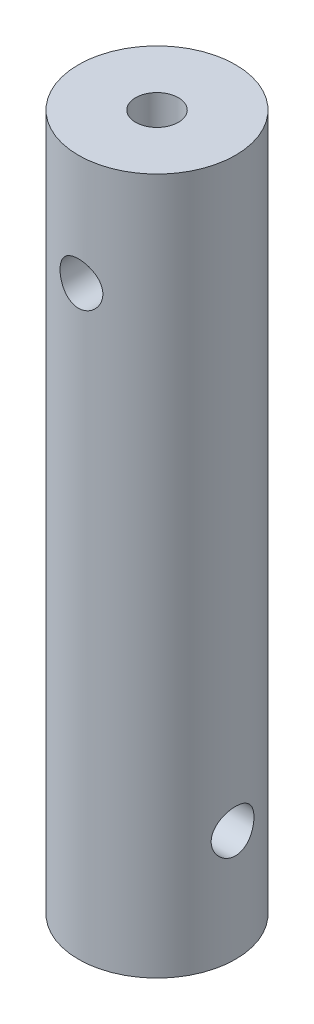
ISO-10303-21;
HEADER;
FILE_DESCRIPTION(('STEP AP214'),'2;1');
FILE_NAME('part.step','',(''),(''),'','','');
FILE_SCHEMA(('AUTOMOTIVE_DESIGN { 1 0 10303 214 1 1 1 1 }'));
ENDSEC;
DATA;
#1=APPLICATION_CONTEXT('core data for automotive mechanical design processes');
#2=APPLICATION_PROTOCOL_DEFINITION('international standard','automotive_design',2000,#1);
#3=PRODUCT_CONTEXT('',#1,'mechanical');
#4=PRODUCT('Part','Part','',(#3));
#5=PRODUCT_RELATED_PRODUCT_CATEGORY('part','',(#4));
#6=PRODUCT_DEFINITION_FORMATION('','',#4);
#7=PRODUCT_DEFINITION_CONTEXT('part definition',#1,'design');
#8=PRODUCT_DEFINITION('design','',#6,#7);
#9=PRODUCT_DEFINITION_SHAPE('','',#8);
#10=(LENGTH_UNIT() NAMED_UNIT(*) SI_UNIT(.MILLI.,.METRE.));
#11=(NAMED_UNIT(*) PLANE_ANGLE_UNIT() SI_UNIT($,.RADIAN.));
#12=(NAMED_UNIT(*) SI_UNIT($,.STERADIAN.) SOLID_ANGLE_UNIT());
#13=UNCERTAINTY_MEASURE_WITH_UNIT(LENGTH_MEASURE(1.E-05),#10,'distance_accuracy_value','');
#14=(GEOMETRIC_REPRESENTATION_CONTEXT(3) GLOBAL_UNCERTAINTY_ASSIGNED_CONTEXT((#13)) GLOBAL_UNIT_ASSIGNED_CONTEXT((#10,
#11,#12)) REPRESENTATION_CONTEXT('',''));
#15=CARTESIAN_POINT('',(0.,0.,0.));
#16=DIRECTION('',(0.,0.,1.));
#17=DIRECTION('',(1.,0.,0.));
#18=AXIS2_PLACEMENT_3D('',#15,#16,#17);
#19=CARTESIAN_POINT('',(5.8293,20.,0.));
#20=DIRECTION('',(0.,1.,0.));
#21=DIRECTION('',(0.,0.,1.));
#22=AXIS2_PLACEMENT_3D('',#19,#20,#21);
#23=PLANE('',#22);
#24=CARTESIAN_POINT('',(0.,20.,0.));
#25=DIRECTION('',(0.,-1.,0.));
#26=DIRECTION('',(0.,0.,-1.));
#27=AXIS2_PLACEMENT_3D('',#24,#25,#26);
#28=CIRCLE('',#27,1.7272);
#29=CARTESIAN_POINT('',(0.,20.,-1.7272));
#30=VERTEX_POINT('',#29);
#31=EDGE_CURVE('E102',#30,#30,#28,.T.);
#32=ORIENTED_EDGE('',*,*,#31,.F.);
#33=EDGE_LOOP('',(#32));
#34=FACE_BOUND('',#33,.T.);
#35=CARTESIAN_POINT('',(0.,20.,0.));
#36=DIRECTION('',(0.,1.,0.));
#37=DIRECTION('',(0.,0.,1.));
#38=AXIS2_PLACEMENT_3D('',#35,#36,#37);
#39=CIRCLE('',#38,6.3373);
#40=CARTESIAN_POINT('',(0.,20.,6.3373));
#41=VERTEX_POINT('',#40);
#42=EDGE_CURVE('E105',#41,#41,#39,.F.);
#43=ORIENTED_EDGE('',*,*,#42,.T.);
#44=EDGE_LOOP('',(#43));
#45=FACE_BOUND('',#44,.T.);
#46=ADVANCED_FACE('F17',(#34,#45),#23,.F.);
#47=CARTESIAN_POINT('',(0.,76.2,0.));
#48=DIRECTION('',(0.,1.,0.));
#49=DIRECTION('',(0.,0.,1.));
#50=AXIS2_PLACEMENT_3D('',#47,#48,#49);
#51=CYLINDRICAL_SURFACE('',#50,6.3373);
#52=CARTESIAN_POINT('',(0.,68.9650064611844,-6.3373));
#53=CARTESIAN_POINT('',(-0.0951376744111191,68.9650043686545,-6.33729864681633));
#54=CARTESIAN_POINT('',(-0.190297467882874,68.9571195857964,-6.33513665790667));
#55=CARTESIAN_POINT('',(-0.377870686616131,68.9258477817384,-6.3267222151742));
#56=CARTESIAN_POINT('',(-0.470282856307396,68.9024537837496,-6.32046792045245));
#57=CARTESIAN_POINT('',(-0.64962656253029,68.8409844502643,-6.30455833904176));
#58=CARTESIAN_POINT('',(-0.736565164620519,68.802928512772,-6.29490754743149));
#59=CARTESIAN_POINT('',(-0.902826293362718,68.7132887916404,-6.27322201943463));
#60=CARTESIAN_POINT('',(-0.982148222671457,68.6617039481685,-6.26118709629709));
#61=CARTESIAN_POINT('',(-1.13283824354689,68.5451569987471,-6.23570533321872));
#62=CARTESIAN_POINT('',(-1.20399639458276,68.4799289064219,-6.22223352256161));
#63=CARTESIAN_POINT('',(-1.33451119126664,68.3385153366035,-6.19555470242467));
#64=CARTESIAN_POINT('',(-1.39386624478539,68.2623283832463,-6.18234772888468));
#65=CARTESIAN_POINT('',(-1.5001270944284,68.0994671467314,-6.15743707536004));
#66=CARTESIAN_POINT('',(-1.54678890596214,68.0126284223276,-6.14576482420407));
#67=CARTESIAN_POINT('',(-1.6247662688059,67.8319684792267,-6.12561337650056));
#68=CARTESIAN_POINT('',(-1.65608479057674,67.7381486161325,-6.11713356197097));
#69=CARTESIAN_POINT('',(-1.70175271630764,67.5485204363137,-6.10458532248206));
#70=CARTESIAN_POINT('',(-1.71648387490563,67.4528107742585,-6.100417841372));
#71=CARTESIAN_POINT('',(-1.72974944241345,67.2601948271869,-6.09667038004404));
#72=CARTESIAN_POINT('',(-1.72828702441142,67.1632887803162,-6.09708950109348));
#73=CARTESIAN_POINT('',(-1.70950947746585,66.9740309275864,-6.10237937558624));
#74=CARTESIAN_POINT('',(-1.69265894569603,66.8816287952162,-6.1071196573165));
#75=CARTESIAN_POINT('',(-1.64432870428128,66.7010156034818,-6.12030846973005));
#76=CARTESIAN_POINT('',(-1.61284777907714,66.6128048930313,-6.12875730853378));
#77=CARTESIAN_POINT('',(-1.53577804799442,66.4418801666521,-6.14852417292795));
#78=CARTESIAN_POINT('',(-1.49002844755493,66.3592425608396,-6.15987461978977));
#79=CARTESIAN_POINT('',(-1.38583211856977,66.2026552924149,-6.18414867747771));
#80=CARTESIAN_POINT('',(-1.32738279064126,66.1287074131992,-6.19707261012679));
#81=CARTESIAN_POINT('',(-1.19708208777922,65.9889473695876,-6.2235782005109));
#82=CARTESIAN_POINT('',(-1.12484130718423,65.9234991263589,-6.2371672499884));
#83=CARTESIAN_POINT('',(-0.970242636206939,65.80557003518,-6.26307708484607));
#84=CARTESIAN_POINT('',(-0.887884311351086,65.7530897443989,-6.27539781571956));
#85=CARTESIAN_POINT('',(-0.714808460885522,65.6624160850076,-6.29746427332398));
#86=CARTESIAN_POINT('',(-0.624053446211196,65.6242910634218,-6.30719761823381));
#87=CARTESIAN_POINT('',(-0.437095728938046,65.5639457334528,-6.32290323631227));
#88=CARTESIAN_POINT('',(-0.340894277055788,65.541721789414,-6.32887636918607));
#89=CARTESIAN_POINT('',(-0.148878213031966,65.5143866438165,-6.33625752613276));
#90=CARTESIAN_POINT('',(-0.0531389599851033,65.5087809408974,-6.33779742640835));
#91=CARTESIAN_POINT('',(0.137912569095707,65.5134723425647,-6.33651906781653));
#92=CARTESIAN_POINT('',(0.233224890262333,65.5237677243956,-6.33370128106969));
#93=CARTESIAN_POINT('',(0.418934951159386,65.5595642910566,-6.32410955859912));
#94=CARTESIAN_POINT('',(0.509390366095269,65.5847874452706,-6.31740800453026));
#95=CARTESIAN_POINT('',(0.684775505098286,65.6493987491432,-6.30081108672499));
#96=CARTESIAN_POINT('',(0.769704615961933,65.6887884675815,-6.29091536928513));
#97=CARTESIAN_POINT('',(0.933530729619364,65.7815170991867,-6.26872146969095));
#98=CARTESIAN_POINT('',(1.01227093207412,65.8351221015718,-6.25637873271262));
#99=CARTESIAN_POINT('',(1.15981126566655,65.9544271045516,-6.23071636948649));
#100=CARTESIAN_POINT('',(1.22860933769476,66.0201296042631,-6.21739654173266));
#101=CARTESIAN_POINT('',(1.35641259216658,66.1640757365502,-6.1907923211858));
#102=CARTESIAN_POINT('',(1.41506825830059,66.242632626605,-6.17752061006974));
#103=CARTESIAN_POINT('',(1.51837489847868,66.4087570073209,-6.15294557775481));
#104=CARTESIAN_POINT('',(1.56302643366734,66.4963241367556,-6.14164217769394));
#105=CARTESIAN_POINT('',(1.63672273360468,66.6775649377132,-6.12241467001691));
#106=CARTESIAN_POINT('',(1.66585610334491,66.7712004400218,-6.1144714314865));
#107=CARTESIAN_POINT('',(1.70788706532457,66.9622963223403,-6.10286634048693));
#108=CARTESIAN_POINT('',(1.72078903417116,67.0597556639849,-6.09920333392231));
#109=CARTESIAN_POINT('',(1.72973108189937,67.2521459560409,-6.09667286629301));
#110=CARTESIAN_POINT('',(1.72633417229053,67.3470490151476,-6.09764527650933));
#111=CARTESIAN_POINT('',(1.70408727659399,67.534874186537,-6.10389945687251));
#112=CARTESIAN_POINT('',(1.68523772236194,67.6277963541052,-6.10918110658888));
#113=CARTESIAN_POINT('',(1.63295363857791,67.808277931505,-6.12336120696575));
#114=CARTESIAN_POINT('',(1.59964342654877,67.895875952665,-6.13222878603006));
#115=CARTESIAN_POINT('',(1.51947987056016,68.064307351525,-6.15258114422972));
#116=CARTESIAN_POINT('',(1.47262431690102,68.1451396227275,-6.16406635032313));
#117=CARTESIAN_POINT('',(1.36501510217198,68.3004199979666,-6.18879930682536));
#118=CARTESIAN_POINT('',(1.30387965433842,68.3745966695788,-6.20209027313998));
#119=CARTESIAN_POINT('',(1.17016556429537,68.5118210182525,-6.22870155248908));
#120=CARTESIAN_POINT('',(1.09758411581629,68.5748659580395,-6.24202187192843));
#121=CARTESIAN_POINT('',(0.941055301848463,68.6894443923546,-6.26755195202529));
#122=CARTESIAN_POINT('',(0.856887755044623,68.7406848461489,-6.27972972931358));
#123=CARTESIAN_POINT('',(0.680802983391851,68.8282089503465,-6.30124767260493));
#124=CARTESIAN_POINT('',(0.588890553787259,68.8645017747929,-6.3105895781834));
#125=CARTESIAN_POINT('',(0.414492113342096,68.916611018558,-6.32423989108634));
#126=CARTESIAN_POINT('',(0.332726034555767,68.9347160329965,-6.32910096501772));
#127=CARTESIAN_POINT('',(0.16731220230855,68.9589140224536,-6.33563144124733));
#128=CARTESIAN_POINT('',(0.083664654098915,68.965008301368,-6.33730118999801));
#129=CARTESIAN_POINT('',(0.,68.9650064611844,-6.3373));
#130=B_SPLINE_CURVE_WITH_KNOTS('',3,(#52,#53,#54,#55,#56,#57,#58,#59,#60,#61,#62,#63,#64,#65,
#66,#67,#68,#69,#70,#71,#72,#73,#74,#75,#76,#77,#78,#79,#80,#81,#82,#83,#84,#85,#86,#87,#88,#89,
#90,#91,#92,#93,#94,#95,#96,#97,#98,#99,#100,#101,#102,#103,#104,#105,#106,#107,#108,#109,#110,
#111,#112,#113,#114,#115,#116,#117,#118,#119,#120,#121,#122,#123,#124,#125,#126,#127,#128,#129),
.UNSPECIFIED.,.T.,.F.,(4,2,2,2,2,2,2,2,2,2,2,2,2,2,2,2,2,2,2,2,2,2,2,2,2,2,2,2,2,2,2,2,2,2,2,2,
2,2,4),(0.,0.285106120738118,0.570340582991151,0.855198963769226,1.14007966656275,
1.43114203934368,1.72224364716802,2.01859839154833,2.31489573895659,2.60422482109503,
2.89349721097502,3.17431465978547,3.45515544435079,3.7392829436408,4.02346865308145,
4.31735600314266,4.61125597790241,4.90653806202597,5.20175261064438,5.48808975476768,
5.77439587872257,6.05553028787058,6.33669583892709,6.62354976425783,6.91046301487155,
7.20585583088746,7.50123680902046,7.79491264610795,8.08850927996145,8.37203871511603,
8.65556022673306,8.93669114520429,9.21786795146533,9.50765841364901,9.79752003589575,
10.0939462779324,10.3901903175525,10.6409416111918,10.8916656815528),.UNSPECIFIED.);
#131=CARTESIAN_POINT('',(0.,68.9650064611844,-6.3373));
#132=VERTEX_POINT('',#131);
#133=EDGE_CURVE('E59',#132,#132,#130,.T.);
#134=ORIENTED_EDGE('',*,*,#133,.T.);
#135=EDGE_LOOP('',(#134));
#136=FACE_BOUND('',#135,.T.);
#137=CARTESIAN_POINT('',(0.,65.5106064611844,6.3373));
#138=CARTESIAN_POINT('',(-0.0951376744111154,65.5106085537143,6.33729864681633));
#139=CARTESIAN_POINT('',(-0.190297467882863,65.5184933365725,6.33513665790667));
#140=CARTESIAN_POINT('',(-0.377870686616126,65.5497651406304,6.3267222151742));
#141=CARTESIAN_POINT('',(-0.470282856307405,65.5731591386191,6.32046792045245));
#142=CARTESIAN_POINT('',(-0.649626562530294,65.6346284721044,6.30455833904176));
#143=CARTESIAN_POINT('',(-0.736565164620502,65.6726844095968,6.29490754743149));
#144=CARTESIAN_POINT('',(-0.902826293362695,65.7623241307284,6.27322201943463));
#145=CARTESIAN_POINT('',(-0.982148222671449,65.8139089742003,6.26118709629709));
#146=CARTESIAN_POINT('',(-1.13283824354689,65.9304559236217,6.23570533321872));
#147=CARTESIAN_POINT('',(-1.20399639458275,65.9956840159469,6.22223352256161));
#148=CARTESIAN_POINT('',(-1.33451119126664,66.1370975857653,6.19555470242467));
#149=CARTESIAN_POINT('',(-1.39386624478539,66.2132845391226,6.18234772888468));
#150=CARTESIAN_POINT('',(-1.5001270944284,66.3761457756374,6.15743707536004));
#151=CARTESIAN_POINT('',(-1.54678890596214,66.4629845000412,6.14576482420407));
#152=CARTESIAN_POINT('',(-1.6247662688059,66.6436444431421,6.12561337650056));
#153=CARTESIAN_POINT('',(-1.65608479057674,66.7374643062363,6.11713356197097));
#154=CARTESIAN_POINT('',(-1.70175271630764,66.9270924860551,6.10458532248206));
#155=CARTESIAN_POINT('',(-1.71648387490563,67.0228021481103,6.10041784137201));
#156=CARTESIAN_POINT('',(-1.72974944241345,67.2154180951818,6.09667038004404));
#157=CARTESIAN_POINT('',(-1.72828702441142,67.3123241420526,6.09708950109348));
#158=CARTESIAN_POINT('',(-1.70950947746585,67.5015819947824,6.10237937558624));
#159=CARTESIAN_POINT('',(-1.69265894569604,67.5939841271527,6.1071196573165));
#160=CARTESIAN_POINT('',(-1.64432870428128,67.774597318887,6.12030846973005));
#161=CARTESIAN_POINT('',(-1.61284777907714,67.8628080293374,6.12875730853378));
#162=CARTESIAN_POINT('',(-1.53577804799442,68.0337327557167,6.14852417292795));
#163=CARTESIAN_POINT('',(-1.49002844755493,68.1163703615291,6.15987461978977));
#164=CARTESIAN_POINT('',(-1.38583211856978,68.2729576299539,6.18414867747771));
#165=CARTESIAN_POINT('',(-1.32738279064127,68.3469055091696,6.19707261012679));
#166=CARTESIAN_POINT('',(-1.19708208777923,68.4866655527812,6.2235782005109));
#167=CARTESIAN_POINT('',(-1.12484130718423,68.5521137960099,6.2371672499884));
#168=CARTESIAN_POINT('',(-0.97024263620694,68.6700428871888,6.26307708484606));
#169=CARTESIAN_POINT('',(-0.887884311351078,68.7225231779699,6.27539781571956));
#170=CARTESIAN_POINT('',(-0.714808460885513,68.8131968373611,6.29746427332398));
#171=CARTESIAN_POINT('',(-0.624053446211196,68.851321858947,6.30719761823381));
#172=CARTESIAN_POINT('',(-0.437095728938053,68.911667188916,6.32290323631227));
#173=CARTESIAN_POINT('',(-0.340894277055792,68.9338911329548,6.32887636918607));
#174=CARTESIAN_POINT('',(-0.148878213031967,68.9612262785523,6.33625752613276));
#175=CARTESIAN_POINT('',(-0.0531389599851039,68.9668319814715,6.33779742640835));
#176=CARTESIAN_POINT('',(0.137912569095706,68.9621405798041,6.33651906781653));
#177=CARTESIAN_POINT('',(0.233224890262331,68.9518451979732,6.33370128106969));
#178=CARTESIAN_POINT('',(0.418934951159386,68.9160486313122,6.32410955859912));
#179=CARTESIAN_POINT('',(0.509390366095272,68.8908254770982,6.31740800453026));
#180=CARTESIAN_POINT('',(0.684775505098288,68.8262141732256,6.30081108672499));
#181=CARTESIAN_POINT('',(0.769704615961931,68.7868244547873,6.29091536928513));
#182=CARTESIAN_POINT('',(0.933530729619365,68.6940958231821,6.26872146969095));
#183=CARTESIAN_POINT('',(1.01227093207413,68.640490820797,6.25637873271262));
#184=CARTESIAN_POINT('',(1.15981126566656,68.5211858178172,6.23071636948649));
#185=CARTESIAN_POINT('',(1.22860933769476,68.4554833181057,6.21739654173266));
#186=CARTESIAN_POINT('',(1.35641259216658,68.3115371858186,6.1907923211858));
#187=CARTESIAN_POINT('',(1.41506825830061,68.2329802957638,6.17752061006973));
#188=CARTESIAN_POINT('',(1.5183748984787,68.0668559150479,6.15294557775481));
#189=CARTESIAN_POINT('',(1.56302643366734,67.9792887856132,6.14164217769394));
#190=CARTESIAN_POINT('',(1.63672273360468,67.7980479846556,6.12241467001691));
#191=CARTESIAN_POINT('',(1.66585610334492,67.704412482347,6.1144714314865));
#192=CARTESIAN_POINT('',(1.70788706532458,67.5133166000285,6.10286634048692));
#193=CARTESIAN_POINT('',(1.72078903417116,67.4158572583839,6.09920333392231));
#194=CARTESIAN_POINT('',(1.72973108189937,67.2234669663279,6.09667286629301));
#195=CARTESIAN_POINT('',(1.72633417229052,67.1285639072211,6.09764527650933));
#196=CARTESIAN_POINT('',(1.70408727659399,66.9407387358317,6.10389945687252));
#197=CARTESIAN_POINT('',(1.68523772236195,66.8478165682635,6.10918110658888));
#198=CARTESIAN_POINT('',(1.63295363857791,66.6673349908637,6.12336120696575));
#199=CARTESIAN_POINT('',(1.59964342654875,66.5797369697037,6.13222878603006));
#200=CARTESIAN_POINT('',(1.51947987056013,66.4113055708438,6.15258114422973));
#201=CARTESIAN_POINT('',(1.47262431690101,66.3304732996413,6.16406635032313));
#202=CARTESIAN_POINT('',(1.36501510217198,66.1751929244022,6.18879930682536));
#203=CARTESIAN_POINT('',(1.30387965433842,66.1010162527901,6.20209027313998));
#204=CARTESIAN_POINT('',(1.17016556429537,65.9637919041163,6.22870155248908));
#205=CARTESIAN_POINT('',(1.09758411581629,65.9007469643293,6.24202187192843));
#206=CARTESIAN_POINT('',(0.941055301848463,65.7861685300142,6.26755195202528));
#207=CARTESIAN_POINT('',(0.856887755044621,65.7349280762199,6.27972972931358));
#208=CARTESIAN_POINT('',(0.680802983391848,65.6474039720223,6.30124767260493));
#209=CARTESIAN_POINT('',(0.588890553787259,65.6111111475759,6.3105895781834));
#210=CARTESIAN_POINT('',(0.414492113342097,65.5590019038109,6.32423989108634));
#211=CARTESIAN_POINT('',(0.332726034555767,65.5408968893723,6.32910096501772));
#212=CARTESIAN_POINT('',(0.16731220230855,65.5166988999152,6.33563144124733));
#213=CARTESIAN_POINT('',(0.0836646540989135,65.5106046210008,6.33730118999801));
#214=CARTESIAN_POINT('',(0.,65.5106064611844,6.3373));
#215=B_SPLINE_CURVE_WITH_KNOTS('',3,(#137,#138,#139,#140,#141,#142,#143,#144,#145,#146,#147,
#148,#149,#150,#151,#152,#153,#154,#155,#156,#157,#158,#159,#160,#161,#162,#163,#164,#165,#166,
#167,#168,#169,#170,#171,#172,#173,#174,#175,#176,#177,#178,#179,#180,#181,#182,#183,#184,#185,
#186,#187,#188,#189,#190,#191,#192,#193,#194,#195,#196,#197,#198,#199,#200,#201,#202,#203,#204,
#205,#206,#207,#208,#209,#210,#211,#212,#213,#214),.UNSPECIFIED.,.T.,.F.,(4,2,2,2,2,2,2,2,2,2,2,
2,2,2,2,2,2,2,2,2,2,2,2,2,2,2,2,2,2,2,2,2,2,2,2,2,2,2,4),(0.,0.285106120738113,
0.570340582991124,0.855198963769218,1.14007966656276,1.4311420393437,1.72224364716802,
2.01859839154835,2.31489573895659,2.60422482109502,2.89349721097502,3.17431465978547,
3.45515544435079,3.7392829436408,4.02346865308147,4.31735600314267,4.61125597790241,
4.90653806202597,5.20175261064438,5.48808975476769,5.77439587872258,6.05553028787058,
6.33669583892711,6.62354976425784,6.91046301487157,7.2058558308875,7.50123680902047,
7.79491264610798,8.08850927996147,8.37203871511609,8.65556022673317,8.93669114520436,
9.21786795146534,9.50765841364902,9.79752003589577,10.0939462779324,10.3901903175526,
10.6409416111918,10.8916656815529),.UNSPECIFIED.);
#216=CARTESIAN_POINT('',(0.,65.5106064611844,6.3373));
#217=VERTEX_POINT('',#216);
#218=EDGE_CURVE('E53',#217,#217,#215,.T.);
#219=ORIENTED_EDGE('',*,*,#218,.T.);
#220=EDGE_LOOP('',(#219));
#221=FACE_BOUND('',#220,.T.);
#222=CARTESIAN_POINT('',(-6.3373,30.6893935388156,0.));
#223=CARTESIAN_POINT('',(-6.33729864681633,30.6893914462857,0.0951376744111205));
#224=CARTESIAN_POINT('',(-6.33513665790666,30.6815066634275,0.19029746788287));
#225=CARTESIAN_POINT('',(-6.3267222151742,30.6502348593696,0.37787068661613));
#226=CARTESIAN_POINT('',(-6.32046792045245,30.6268408613808,0.470282856307403));
#227=CARTESIAN_POINT('',(-6.30455833904176,30.5653715278956,0.649626562530296));
#228=CARTESIAN_POINT('',(-6.29490754743149,30.5273155904032,0.736565164620515));
#229=CARTESIAN_POINT('',(-6.27322201943462,30.4376758692716,0.902826293362709));
#230=CARTESIAN_POINT('',(-6.26118709629709,30.3860910257997,0.982148222671452));
#231=CARTESIAN_POINT('',(-6.23570533321872,30.2695440763783,1.13283824354689));
#232=CARTESIAN_POINT('',(-6.22223352256161,30.2043159840531,1.20399639458277));
#233=CARTESIAN_POINT('',(-6.19555470242466,30.0629024142347,1.33451119126665));
#234=CARTESIAN_POINT('',(-6.18234772888467,29.9867154608774,1.3938662447854));
#235=CARTESIAN_POINT('',(-6.15743707536003,29.8238542243625,1.50012709442839));
#236=CARTESIAN_POINT('',(-6.14576482420406,29.7370154999588,1.54678890596214));
#237=CARTESIAN_POINT('',(-6.12561337650056,29.5563555568579,1.62476626880591));
#238=CARTESIAN_POINT('',(-6.11713356197097,29.4625356937638,1.65608479057674));
#239=CARTESIAN_POINT('',(-6.10458532248206,29.2729075139449,1.70175271630764));
#240=CARTESIAN_POINT('',(-6.100417841372,29.1771978518897,1.71648387490563));
#241=CARTESIAN_POINT('',(-6.09667038004403,28.9845819048182,1.72974944241345));
#242=CARTESIAN_POINT('',(-6.09708950109347,28.8876758579474,1.72828702441142));
#243=CARTESIAN_POINT('',(-6.10237937558623,28.6984180052176,1.70950947746586));
#244=CARTESIAN_POINT('',(-6.10711965731649,28.6060158728474,1.69265894569605));
#245=CARTESIAN_POINT('',(-6.12030846973004,28.425402681113,1.64432870428129));
#246=CARTESIAN_POINT('',(-6.12875730853378,28.3371919706626,1.61284777907714));
#247=CARTESIAN_POINT('',(-6.14852417292794,28.1662672442834,1.53577804799443));
#248=CARTESIAN_POINT('',(-6.15987461978976,28.0836296384709,1.49002844755496));
#249=CARTESIAN_POINT('',(-6.18414867747771,27.9270423700461,1.3858321185698));
#250=CARTESIAN_POINT('',(-6.19707261012678,27.8530944908304,1.32738279064127));
#251=CARTESIAN_POINT('',(-6.2235782005109,27.7133344472188,1.19708208777921));
#252=CARTESIAN_POINT('',(-6.2371672499884,27.6478862039901,1.12484130718423));
#253=CARTESIAN_POINT('',(-6.26307708484606,27.5299571128112,0.970242636206951));
#254=CARTESIAN_POINT('',(-6.27539781571955,27.4774768220301,0.887884311351099));
#255=CARTESIAN_POINT('',(-6.29746427332397,27.3868031626388,0.714808460885526));
#256=CARTESIAN_POINT('',(-6.30719761823381,27.348678141053,0.624053446211192));
#257=CARTESIAN_POINT('',(-6.32290323631227,27.288332811084,0.437095728938042));
#258=CARTESIAN_POINT('',(-6.32887636918606,27.2661088670452,0.340894277055792));
#259=CARTESIAN_POINT('',(-6.33625752613275,27.2387737214477,0.148878213031975));
#260=CARTESIAN_POINT('',(-6.33779742640835,27.2331680185285,0.0531389599851087));
#261=CARTESIAN_POINT('',(-6.33651906781653,27.2378594201959,-0.137912569095703));
#262=CARTESIAN_POINT('',(-6.33370128106969,27.2481548020268,-0.233224890262328));
#263=CARTESIAN_POINT('',(-6.32410955859912,27.2839513686878,-0.41893495115938));
#264=CARTESIAN_POINT('',(-6.31740800453026,27.3091745229018,-0.509390366095265));
#265=CARTESIAN_POINT('',(-6.30081108672499,27.3737858267744,-0.684775505098283));
#266=CARTESIAN_POINT('',(-6.29091536928512,27.4131755452127,-0.769704615961928));
#267=CARTESIAN_POINT('',(-6.26872146969094,27.5059041768179,-0.933530729619359));
#268=CARTESIAN_POINT('',(-6.25637873271262,27.559509179203,-1.01227093207412));
#269=CARTESIAN_POINT('',(-6.23071636948649,27.6788141821828,-1.15981126566654));
#270=CARTESIAN_POINT('',(-6.21739654173266,27.7445166818943,-1.22860933769475));
#271=CARTESIAN_POINT('',(-6.1907923211858,27.8884628141814,-1.35641259216658));
#272=CARTESIAN_POINT('',(-6.17752061006973,27.9670197042362,-1.4150682583006));
#273=CARTESIAN_POINT('',(-6.1529455777548,28.1331440849521,-1.51837489847868));
#274=CARTESIAN_POINT('',(-6.14164217769393,28.2207112143868,-1.56302643366733));
#275=CARTESIAN_POINT('',(-6.1224146700169,28.4019520153444,-1.63672273360467));
#276=CARTESIAN_POINT('',(-6.1144714314865,28.4955875176529,-1.66585610334491));
#277=CARTESIAN_POINT('',(-6.10286634048693,28.6866833999715,-1.70788706532457));
#278=CARTESIAN_POINT('',(-6.09920333392231,28.784142741616,-1.72078903417115));
#279=CARTESIAN_POINT('',(-6.096672866293,28.976533033672,-1.72973108189936));
#280=CARTESIAN_POINT('',(-6.09764527650932,29.0714360927788,-1.72633417229052));
#281=CARTESIAN_POINT('',(-6.10389945687251,29.2592612641682,-1.70408727659399));
#282=CARTESIAN_POINT('',(-6.10918110658888,29.3521834317365,-1.68523772236194));
#283=CARTESIAN_POINT('',(-6.12336120696575,29.5326650091362,-1.6329536385779));
#284=CARTESIAN_POINT('',(-6.13222878603005,29.6202630302962,-1.59964342654876));
#285=CARTESIAN_POINT('',(-6.15258114422972,29.7886944291562,-1.51947987056014));
#286=CARTESIAN_POINT('',(-6.16406635032313,29.8695267003587,-1.47262431690101));
#287=CARTESIAN_POINT('',(-6.18879930682536,30.0248070755978,-1.36501510217198));
#288=CARTESIAN_POINT('',(-6.20209027313998,30.0989837472099,-1.30387965433842));
#289=CARTESIAN_POINT('',(-6.22870155248907,30.2362080958837,-1.17016556429536));
#290=CARTESIAN_POINT('',(-6.24202187192842,30.2992530356707,-1.09758411581628));
#291=CARTESIAN_POINT('',(-6.26755195202527,30.4138314699858,-0.941055301848458));
#292=CARTESIAN_POINT('',(-6.27972972931358,30.4650719237801,-0.85688775504462));
#293=CARTESIAN_POINT('',(-6.30124767260493,30.5525960279777,-0.680802983391848));
#294=CARTESIAN_POINT('',(-6.3105895781834,30.5888888524241,-0.588890553787254));
#295=CARTESIAN_POINT('',(-6.32423989108634,30.6409980961892,-0.41449211334209));
#296=CARTESIAN_POINT('',(-6.32910096501772,30.6591031106277,-0.332726034555762));
#297=CARTESIAN_POINT('',(-6.33563144124733,30.6833011000848,-0.167312202308546));
#298=CARTESIAN_POINT('',(-6.33730118999801,30.6893953789992,-0.0836646540989101));
#299=CARTESIAN_POINT('',(-6.3373,30.6893935388156,0.));
#300=B_SPLINE_CURVE_WITH_KNOTS('',3,(#222,#223,#224,#225,#226,#227,#228,#229,#230,#231,#232,
#233,#234,#235,#236,#237,#238,#239,#240,#241,#242,#243,#244,#245,#246,#247,#248,#249,#250,#251,
#252,#253,#254,#255,#256,#257,#258,#259,#260,#261,#262,#263,#264,#265,#266,#267,#268,#269,#270,
#271,#272,#273,#274,#275,#276,#277,#278,#279,#280,#281,#282,#283,#284,#285,#286,#287,#288,#289,
#290,#291,#292,#293,#294,#295,#296,#297,#298,#299),.UNSPECIFIED.,.T.,.F.,(4,2,2,2,2,2,2,2,2,2,2,
2,2,2,2,2,2,2,2,2,2,2,2,2,2,2,2,2,2,2,2,2,2,2,2,2,2,2,4),(0.,0.285106120738114,
0.570340582991136,0.855198963769219,1.14007966656275,1.43114203934371,1.72224364716806,
2.01859839154833,2.31489573895653,2.604224821095,2.89349721097502,3.17431465978544,
3.45515544435073,3.73928294364075,4.02346865308142,4.31735600314265,4.61125597790242,
4.90653806202597,5.20175261064438,5.48808975476769,5.77439587872257,6.05553028787058,
6.3366958389271,6.62354976425783,6.91046301487156,7.20585583088748,7.50123680902047,
7.79491264610795,8.08850927996142,8.37203871511603,8.65556022673312,8.93669114520432,
9.21786795146534,9.50765841364902,9.79752003589576,10.0939462779324,10.3901903175525,
10.6409416111918,10.8916656815529),.UNSPECIFIED.);
#301=CARTESIAN_POINT('',(-6.3373,30.6893935388156,0.));
#302=VERTEX_POINT('',#301);
#303=EDGE_CURVE('E56',#302,#302,#300,.T.);
#304=ORIENTED_EDGE('',*,*,#303,.T.);
#305=EDGE_LOOP('',(#304));
#306=FACE_BOUND('',#305,.T.);
#307=CARTESIAN_POINT('',(6.09738890427698,28.9621935388156,-1.7272));
#308=CARTESIAN_POINT('',(6.09739046985027,28.8671298940962,-1.72719787245455));
#309=CARTESIAN_POINT('',(6.09963640286068,28.7720440660499,-1.71932492999687));
#310=CARTESIAN_POINT('',(6.10834911606326,28.5846242028052,-1.68810441213683));
#311=CARTESIAN_POINT('',(6.11481789144541,28.4922914899608,-1.66474952181112));
#312=CARTESIAN_POINT('',(6.13119044506908,28.3131164239047,-1.60339444794951));
#313=CARTESIAN_POINT('',(6.14108924466429,28.2262663275568,-1.56541548227438));
#314=CARTESIAN_POINT('',(6.16320009080084,28.0601554721651,-1.47595741644584));
#315=CARTESIAN_POINT('',(6.17541234616772,27.9808953992126,-1.42447709742294));
#316=CARTESIAN_POINT('',(6.20113164032319,27.8301439441249,-1.30803925579137));
#317=CARTESIAN_POINT('',(6.21466244395106,27.7588802030606,-1.24279219464111));
#318=CARTESIAN_POINT('',(6.24128950043603,27.6281592354844,-1.10129532904369));
#319=CARTESIAN_POINT('',(6.254385706406,27.5687032794437,-1.02504434213994));
#320=CARTESIAN_POINT('',(6.27893397567212,27.462329783048,-0.862118720093235));
#321=CARTESIAN_POINT('',(6.29035474073571,27.4156395319602,-0.775290562823356));
#322=CARTESIAN_POINT('',(6.30999206519969,27.3376067691287,-0.594653062646446));
#323=CARTESIAN_POINT('',(6.31820918989841,27.3062615494278,-0.500844954868585));
#324=CARTESIAN_POINT('',(6.33034532906591,27.2605481605535,-0.311287505888385));
#325=CARTESIAN_POINT('',(6.33436227813486,27.2457925271725,-0.215637985542515));
#326=CARTESIAN_POINT('',(6.33798829701325,27.2324571042252,-0.0231423797947268));
#327=CARTESIAN_POINT('',(6.3375981361844,27.2338744912892,0.0737034938077614));
#328=CARTESIAN_POINT('',(6.33252522831071,27.2525741653736,0.263142232568678));
#329=CARTESIAN_POINT('',(6.32795579464955,27.269437676354,0.355779935454501));
#330=CARTESIAN_POINT('',(6.31517214409202,27.3178730949866,0.536857217156067));
#331=CARTESIAN_POINT('',(6.30695771484605,27.3494458595738,0.625296551051527));
#332=CARTESIAN_POINT('',(6.28764091593364,27.4267180843628,0.796523202475907));
#333=CARTESIAN_POINT('',(6.27650980976626,27.4725590168625,0.879243300284831));
#334=CARTESIAN_POINT('',(6.25255592285951,27.5769572238548,1.03595826420615));
#335=CARTESIAN_POINT('',(6.23973279997062,27.6355170718419,1.10995135984976));
#336=CARTESIAN_POINT('',(6.21329703380947,27.7659055282857,1.24961185772986));
#337=CARTESIAN_POINT('',(6.1996722576953,27.8380990532547,1.31493668259018));
#338=CARTESIAN_POINT('',(6.17353743433312,27.9925563606099,1.43263808075697));
#339=CARTESIAN_POINT('',(6.16102746150009,28.0748208143785,1.48501379010183));
#340=CARTESIAN_POINT('',(6.13848828884735,28.2478540411327,1.57560668629991));
#341=CARTESIAN_POINT('',(6.12847624538193,28.338676026416,1.61372680802697));
#342=CARTESIAN_POINT('',(6.11227766958572,28.5257815325359,1.67404276699794));
#343=CARTESIAN_POINT('',(6.10609013972423,28.6220636220792,1.69624275686063));
#344=CARTESIAN_POINT('',(6.09845479401142,28.8141426707083,1.72348942910473));
#345=CARTESIAN_POINT('',(6.09686537031595,28.9098613553508,1.72904878595011));
#346=CARTESIAN_POINT('',(6.09821805112225,29.1008614413392,1.72427215251955));
#347=CARTESIAN_POINT('',(6.10115964877449,29.1961428903992,1.71393794013166));
#348=CARTESIAN_POINT('',(6.11110576002118,29.3815616606908,1.67812031905504));
#349=CARTESIAN_POINT('',(6.11802657672898,29.4717641454693,1.65294872555845));
#350=CARTESIAN_POINT('',(6.13506871942744,29.6466658662297,1.58852329073751));
#351=CARTESIAN_POINT('',(6.14519047695768,29.7313643583256,1.54926755054196));
#352=CARTESIAN_POINT('',(6.16778195893567,29.8949886902924,1.45675901632109));
#353=CARTESIAN_POINT('',(6.18030000574655,29.9737386264515,1.40320716993855));
#354=CARTESIAN_POINT('',(6.20616163122663,30.1213225600823,1.28399458546405));
#355=CARTESIAN_POINT('',(6.21950537190705,30.1901546026669,1.21833146595406));
#356=CARTESIAN_POINT('',(6.24600517012562,30.3180961020081,1.07438226330445));
#357=CARTESIAN_POINT('',(6.2591432357158,30.3768470122188,0.995773517652026));
#358=CARTESIAN_POINT('',(6.28333705742776,30.4803213564912,0.829513653986763));
#359=CARTESIAN_POINT('',(6.29439292432504,30.5250455368762,0.741863017397729));
#360=CARTESIAN_POINT('',(6.31310537393174,30.5987801672331,0.560624003160167));
#361=CARTESIAN_POINT('',(6.32078744559088,30.6279088214717,0.467086475145325));
#362=CARTESIAN_POINT('',(6.33199907819274,30.6699632512782,0.276202398747753));
#363=CARTESIAN_POINT('',(6.33552960361475,30.6828927902391,0.178856740494654));
#364=CARTESIAN_POINT('',(6.33799256042309,30.6919375080764,-0.0135370922425592));
#365=CARTESIAN_POINT('',(6.33706852395064,30.6885775373062,-0.108559096706156));
#366=CARTESIAN_POINT('',(6.33105308497213,30.6663633291845,-0.296632292393206));
#367=CARTESIAN_POINT('',(6.32596185154475,30.6475097204673,-0.389683563419512));
#368=CARTESIAN_POINT('',(6.31221477491528,30.5951453937231,-0.570512798710947));
#369=CARTESIAN_POINT('',(6.30358587729802,30.5617453552657,-0.658324998333323));
#370=CARTESIAN_POINT('',(6.28366372638584,30.4813348432471,-0.827148858301237));
#371=CARTESIAN_POINT('',(6.27237008694004,30.4343223968714,-0.908159530720497));
#372=CARTESIAN_POINT('',(6.24793425913812,30.3265090780482,-1.06350706781131));
#373=CARTESIAN_POINT('',(6.23474963486825,30.2653632835773,-1.13759785174414));
#374=CARTESIAN_POINT('',(6.20818300614523,30.1316675015935,-1.27464435352606));
#375=CARTESIAN_POINT('',(6.19480094992138,30.0591144729164,-1.33759709243744));
#376=CARTESIAN_POINT('',(6.16899481243833,29.9026342735249,-1.45203401420049));
#377=CARTESIAN_POINT('',(6.15660025032444,29.8184818107373,-1.50321741036909));
#378=CARTESIAN_POINT('',(6.13459742073985,29.6424385009502,-1.59063859702361));
#379=CARTESIAN_POINT('',(6.12498740966456,29.5505525431634,-1.62688574618054));
#380=CARTESIAN_POINT('',(6.11091307928669,29.3762626943389,-1.67890402212879));
#381=CARTESIAN_POINT('',(6.10588364776463,29.2945827963047,-1.69697131879066));
#382=CARTESIAN_POINT('',(6.09912107993061,29.1293386684326,-1.72111948698923));
#383=CARTESIAN_POINT('',(6.09738752780547,29.0457746776409,-1.72720187056442));
#384=CARTESIAN_POINT('',(6.09738890427698,28.9621935388156,-1.7272));
#385=B_SPLINE_CURVE_WITH_KNOTS('',3,(#307,#308,#309,#310,#311,#312,#313,#314,#315,#316,#317,
#318,#319,#320,#321,#322,#323,#324,#325,#326,#327,#328,#329,#330,#331,#332,#333,#334,#335,#336,
#337,#338,#339,#340,#341,#342,#343,#344,#345,#346,#347,#348,#349,#350,#351,#352,#353,#354,#355,
#356,#357,#358,#359,#360,#361,#362,#363,#364,#365,#366,#367,#368,#369,#370,#371,#372,#373,#374,
#375,#376,#377,#378,#379,#380,#381,#382,#383,#384),.UNSPECIFIED.,.T.,.F.,(4,2,2,2,2,2,2,2,2,2,2,
2,2,2,2,2,2,2,2,2,2,2,2,2,2,2,2,2,2,2,2,2,2,2,2,2,2,2,4),(0.,0.284883436602175,
0.569901571191461,0.854507725819937,1.13913958285289,1.4304925913003,1.72187693121798,
2.01815378239936,2.31437833036381,2.60353043321826,2.89263205874783,3.17412035808805,
3.45562505848422,3.74001498953872,4.02446251661052,4.31802077503707,4.61159861431179,
4.90714049877944,5.20260526581945,5.48886836465633,5.77509944383031,6.05551951949487,
6.33597741653666,6.62283724955895,6.90975354756539,7.20537906219681,7.50098884474558,
7.79432518162574,8.08759335769763,8.37147638935492,8.65534790339187,8.93709625754777,
9.21888546529055,9.50845642742063,9.79810472036954,10.0944896069187,10.3906885028451,
10.6411931697946,10.8916662305945),.UNSPECIFIED.);
#386=CARTESIAN_POINT('',(6.09738890427698,28.9621935388156,-1.7272));
#387=VERTEX_POINT('',#386);
#388=EDGE_CURVE('E52',#387,#387,#385,.T.);
#389=ORIENTED_EDGE('',*,*,#388,.T.);
#390=EDGE_LOOP('',(#389));
#391=FACE_BOUND('',#390,.T.);
#392=ORIENTED_EDGE('',*,*,#42,.F.);
#393=EDGE_LOOP('',(#392));
#394=FACE_BOUND('',#393,.T.);
#395=CARTESIAN_POINT('',(0.,76.2,0.));
#396=DIRECTION('',(0.,-1.,0.));
#397=DIRECTION('',(0.,0.,-1.));
#398=AXIS2_PLACEMENT_3D('',#395,#396,#397);
#399=CIRCLE('',#398,6.3373);
#400=CARTESIAN_POINT('',(0.,76.2,-6.3373));
#401=VERTEX_POINT('',#400);
#402=EDGE_CURVE('E108',#401,#401,#399,.T.);
#403=ORIENTED_EDGE('',*,*,#402,.T.);
#404=EDGE_LOOP('',(#403));
#405=FACE_BOUND('',#404,.T.);
#406=ADVANCED_FACE('F75',(#136,#221,#306,#391,#394,#405),#51,.T.);
#407=CARTESIAN_POINT('',(0.,76.2,0.));
#408=DIRECTION('',(0.,-1.,0.));
#409=DIRECTION('',(0.,0.,-1.));
#410=AXIS2_PLACEMENT_3D('',#407,#408,#409);
#411=PLANE('',#410);
#412=CARTESIAN_POINT('',(0.,76.2,0.));
#413=DIRECTION('',(0.,1.,0.));
#414=DIRECTION('',(0.,0.,1.));
#415=AXIS2_PLACEMENT_3D('',#412,#413,#414);
#416=CIRCLE('',#415,1.7272);
#417=CARTESIAN_POINT('',(0.,76.2,1.7272));
#418=VERTEX_POINT('',#417);
#419=EDGE_CURVE('E50',#418,#418,#416,.T.);
#420=ORIENTED_EDGE('',*,*,#419,.F.);
#421=EDGE_LOOP('',(#420));
#422=FACE_BOUND('',#421,.T.);
#423=ORIENTED_EDGE('',*,*,#402,.F.);
#424=EDGE_LOOP('',(#423));
#425=FACE_BOUND('',#424,.T.);
#426=ADVANCED_FACE('F84',(#422,#425),#411,.F.);
#427=CARTESIAN_POINT('',(0.,20.,0.));
#428=DIRECTION('',(0.,-1.,0.));
#429=DIRECTION('',(0.,0.,-1.));
#430=AXIS2_PLACEMENT_3D('',#427,#428,#429);
#431=CYLINDRICAL_SURFACE('',#430,1.7272);
#432=CARTESIAN_POINT('',(0.,28.9621935388156,0.));
#433=DIRECTION('',(-0.707106781186548,-0.707106781186548,0.));
#434=DIRECTION('',(0.707106781186548,-0.707106781186548,0.));
#435=AXIS2_PLACEMENT_3D('',#432,#433,#434);
#436=ELLIPSE('',#435,2.4426296649308,1.7272);
#437=CARTESIAN_POINT('',(0.,28.9621935388156,1.7272));
#438=VERTEX_POINT('',#437);
#439=CARTESIAN_POINT('',(0.,28.9621935388156,-1.7272));
#440=VERTEX_POINT('',#439);
#441=EDGE_CURVE('E107',#438,#440,#436,.F.);
#442=ORIENTED_EDGE('',*,*,#441,.T.);
#443=CARTESIAN_POINT('',(0.,28.9621935388156,0.));
#444=DIRECTION('',(0.707106781186548,-0.707106781186548,0.));
#445=DIRECTION('',(-0.707106781186548,-0.707106781186548,0.));
#446=AXIS2_PLACEMENT_3D('',#443,#444,#445);
#447=ELLIPSE('',#446,2.4426296649308,1.7272);
#448=EDGE_CURVE('E35',#440,#438,#447,.F.);
#449=ORIENTED_EDGE('',*,*,#448,.T.);
#450=EDGE_LOOP('',(#442,#449));
#451=FACE_BOUND('',#450,.T.);
#452=ORIENTED_EDGE('',*,*,#31,.T.);
#453=EDGE_LOOP('',(#452));
#454=FACE_BOUND('',#453,.T.);
#455=ADVANCED_FACE('F81',(#451,#454),#431,.F.);
#456=CARTESIAN_POINT('',(-6.3373,28.9621935388156,0.));
#457=DIRECTION('',(1.,0.,0.));
#458=DIRECTION('',(0.,0.,-1.));
#459=AXIS2_PLACEMENT_3D('',#456,#457,#458);
#460=CYLINDRICAL_SURFACE('',#459,1.7272);
#461=ORIENTED_EDGE('',*,*,#441,.F.);
#462=ORIENTED_EDGE('',*,*,#448,.F.);
#463=EDGE_LOOP('',(#461,#462));
#464=FACE_BOUND('',#463,.T.);
#465=ORIENTED_EDGE('',*,*,#388,.F.);
#466=EDGE_LOOP('',(#465));
#467=FACE_BOUND('',#466,.T.);
#468=ORIENTED_EDGE('',*,*,#303,.F.);
#469=EDGE_LOOP('',(#468));
#470=FACE_BOUND('',#469,.T.);
#471=ADVANCED_FACE('F46',(#464,#467,#470),#460,.F.);
#472=CARTESIAN_POINT('',(0.,76.2,0.));
#473=DIRECTION('',(0.,1.,0.));
#474=DIRECTION('',(0.,0.,1.));
#475=AXIS2_PLACEMENT_3D('',#472,#473,#474);
#476=CYLINDRICAL_SURFACE('',#475,1.7272);
#477=CARTESIAN_POINT('',(0.,67.2378064611844,0.));
#478=DIRECTION('',(0.,0.707106781186548,-0.707106781186548));
#479=DIRECTION('',(0.,0.707106781186548,0.707106781186548));
#480=AXIS2_PLACEMENT_3D('',#477,#478,#479);
#481=ELLIPSE('',#480,2.4426296649308,1.7272);
#482=CARTESIAN_POINT('',(1.7272,67.2378064611844,0.));
#483=VERTEX_POINT('',#482);
#484=CARTESIAN_POINT('',(-1.7272,67.2378064611844,0.));
#485=VERTEX_POINT('',#484);
#486=EDGE_CURVE('E24',#483,#485,#481,.F.);
#487=ORIENTED_EDGE('',*,*,#486,.T.);
#488=CARTESIAN_POINT('',(0.,67.2378064611844,0.));
#489=DIRECTION('',(0.,0.707106781186548,0.707106781186548));
#490=DIRECTION('',(0.,0.707106781186548,-0.707106781186548));
#491=AXIS2_PLACEMENT_3D('',#488,#489,#490);
#492=ELLIPSE('',#491,2.4426296649308,1.7272);
#493=EDGE_CURVE('E11',#485,#483,#492,.F.);
#494=ORIENTED_EDGE('',*,*,#493,.T.);
#495=EDGE_LOOP('',(#487,#494));
#496=FACE_BOUND('',#495,.T.);
#497=ORIENTED_EDGE('',*,*,#419,.T.);
#498=EDGE_LOOP('',(#497));
#499=FACE_BOUND('',#498,.T.);
#500=ADVANCED_FACE('F43',(#496,#499),#476,.F.);
#501=CARTESIAN_POINT('',(0.,67.2378064611844,-6.3373));
#502=DIRECTION('',(0.,0.,1.));
#503=DIRECTION('',(1.,0.,0.));
#504=AXIS2_PLACEMENT_3D('',#501,#502,#503);
#505=CYLINDRICAL_SURFACE('',#504,1.7272);
#506=ORIENTED_EDGE('',*,*,#486,.F.);
#507=ORIENTED_EDGE('',*,*,#493,.F.);
#508=EDGE_LOOP('',(#506,#507));
#509=FACE_BOUND('',#508,.T.);
#510=ORIENTED_EDGE('',*,*,#133,.F.);
#511=EDGE_LOOP('',(#510));
#512=FACE_BOUND('',#511,.T.);
#513=ORIENTED_EDGE('',*,*,#218,.F.);
#514=EDGE_LOOP('',(#513));
#515=FACE_BOUND('',#514,.T.);
#516=ADVANCED_FACE('F40',(#509,#512,#515),#505,.F.);
#517=CLOSED_SHELL('',(#46,#406,#426,#455,#471,#500,#516));
#518=MANIFOLD_SOLID_BREP('B1',#517);
#519=ADVANCED_BREP_SHAPE_REPRESENTATION('',(#18,#518),#14);
#520=SHAPE_DEFINITION_REPRESENTATION(#9,#519);
ENDSEC;
END-ISO-10303-21;
